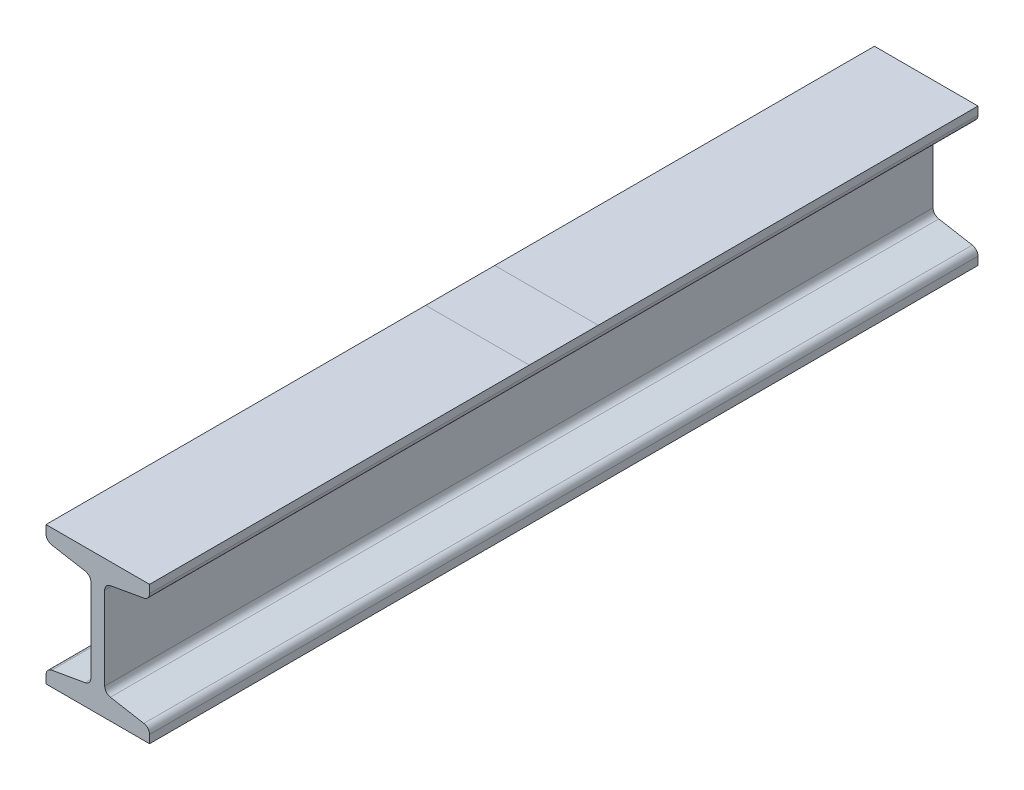
ISO-10303-21;
HEADER;
FILE_DESCRIPTION(('STEP AP214'),'2;1');
FILE_NAME('part.step','',(''),(''),'','','');
FILE_SCHEMA(('AUTOMOTIVE_DESIGN { 1 0 10303 214 1 1 1 1 }'));
ENDSEC;
DATA;
#1=APPLICATION_CONTEXT('core data for automotive mechanical design processes');
#2=APPLICATION_PROTOCOL_DEFINITION('international standard','automotive_design',2000,#1);
#3=PRODUCT_CONTEXT('',#1,'mechanical');
#4=PRODUCT('Part','Part','',(#3));
#5=PRODUCT_RELATED_PRODUCT_CATEGORY('part','',(#4));
#6=PRODUCT_DEFINITION_FORMATION('','',#4);
#7=PRODUCT_DEFINITION_CONTEXT('part definition',#1,'design');
#8=PRODUCT_DEFINITION('design','',#6,#7);
#9=PRODUCT_DEFINITION_SHAPE('','',#8);
#10=(LENGTH_UNIT() NAMED_UNIT(*) SI_UNIT(.MILLI.,.METRE.));
#11=(NAMED_UNIT(*) PLANE_ANGLE_UNIT() SI_UNIT($,.RADIAN.));
#12=(NAMED_UNIT(*) SI_UNIT($,.STERADIAN.) SOLID_ANGLE_UNIT());
#13=UNCERTAINTY_MEASURE_WITH_UNIT(LENGTH_MEASURE(1.E-05),#10,'distance_accuracy_value','');
#14=(GEOMETRIC_REPRESENTATION_CONTEXT(3) GLOBAL_UNCERTAINTY_ASSIGNED_CONTEXT((#13)) GLOBAL_UNIT_ASSIGNED_CONTEXT((#10,
#11,#12)) REPRESENTATION_CONTEXT('',''));
#15=CARTESIAN_POINT('',(0.,0.,0.));
#16=DIRECTION('',(0.,0.,1.));
#17=DIRECTION('',(1.,0.,0.));
#18=AXIS2_PLACEMENT_3D('',#15,#16,#17);
#19=CARTESIAN_POINT('',(-37.5,-50.,600.));
#20=DIRECTION('',(0.,1.,0.));
#21=DIRECTION('',(0.,0.,1.));
#22=AXIS2_PLACEMENT_3D('',#19,#20,#21);
#23=PLANE('',#22);
#24=DIRECTION('',(-1.,0.,0.));
#25=VECTOR('',#24,1.);
#26=CARTESIAN_POINT('',(-37.5000000000003,-50.,40.));
#27=LINE('',#26,#25);
#28=CARTESIAN_POINT('',(37.5,-50.,40.));
#29=VERTEX_POINT('',#28);
#30=CARTESIAN_POINT('',(-37.5,-50.,40.));
#31=VERTEX_POINT('',#30);
#32=EDGE_CURVE('E280',#29,#31,#27,.T.);
#33=ORIENTED_EDGE('',*,*,#32,.F.);
#34=DIRECTION('',(0.,0.,-1.));
#35=VECTOR('',#34,1.);
#36=CARTESIAN_POINT('',(37.5,-50.,600.));
#37=LINE('',#36,#35);
#38=CARTESIAN_POINT('',(37.5,-50.,560.));
#39=VERTEX_POINT('',#38);
#40=EDGE_CURVE('E519',#39,#29,#37,.T.);
#41=ORIENTED_EDGE('',*,*,#40,.F.);
#42=DIRECTION('',(1.,0.,0.));
#43=VECTOR('',#42,1.);
#44=CARTESIAN_POINT('',(-37.5,-50.,560.));
#45=LINE('',#44,#43);
#46=CARTESIAN_POINT('',(-37.5,-50.,560.));
#47=VERTEX_POINT('',#46);
#48=EDGE_CURVE('E286',#47,#39,#45,.T.);
#49=ORIENTED_EDGE('',*,*,#48,.F.);
#50=DIRECTION('',(0.,0.,-1.));
#51=VECTOR('',#50,1.);
#52=CARTESIAN_POINT('',(-37.5,-50.,600.));
#53=LINE('',#52,#51);
#54=EDGE_CURVE('E359',#47,#31,#53,.T.);
#55=ORIENTED_EDGE('',*,*,#54,.T.);
#56=EDGE_LOOP('',(#33,#41,#49,#55));
#57=FACE_BOUND('',#56,.T.);
#58=ADVANCED_FACE('F54',(#57),#23,.F.);
#59=CARTESIAN_POINT('',(37.5,-50.,0.));
#60=VERTEX_POINT('',#59);
#61=EDGE_CURVE('E523',#29,#60,#37,.T.);
#62=ORIENTED_EDGE('',*,*,#61,.F.);
#63=ORIENTED_EDGE('',*,*,#32,.T.);
#64=CARTESIAN_POINT('',(-37.5,-50.,0.));
#65=VERTEX_POINT('',#64);
#66=EDGE_CURVE('E360',#31,#65,#53,.T.);
#67=ORIENTED_EDGE('',*,*,#66,.T.);
#68=DIRECTION('',(1.,0.,0.));
#69=VECTOR('',#68,1.);
#70=CARTESIAN_POINT('',(-37.5,-50.,0.));
#71=LINE('',#70,#69);
#72=EDGE_CURVE('E384',#65,#60,#71,.T.);
#73=ORIENTED_EDGE('',*,*,#72,.T.);
#74=EDGE_LOOP('',(#62,#63,#67,#73));
#75=FACE_BOUND('',#74,.T.);
#76=ADVANCED_FACE('F572',(#75),#23,.F.);
#77=CARTESIAN_POINT('',(-37.5,50.,600.));
#78=DIRECTION('',(0.,-1.,0.));
#79=DIRECTION('',(0.,0.,-1.));
#80=AXIS2_PLACEMENT_3D('',#77,#78,#79);
#81=PLANE('',#80);
#82=DIRECTION('',(-1.,0.,0.));
#83=VECTOR('',#82,1.);
#84=CARTESIAN_POINT('',(-37.5,50.,275.));
#85=LINE('',#84,#83);
#86=CARTESIAN_POINT('',(37.5,50.,275.));
#87=VERTEX_POINT('',#86);
#88=CARTESIAN_POINT('',(-37.5,50.,275.));
#89=VERTEX_POINT('',#88);
#90=EDGE_CURVE('E495',#87,#89,#85,.T.);
#91=ORIENTED_EDGE('',*,*,#90,.F.);
#92=DIRECTION('',(0.,0.,-1.));
#93=VECTOR('',#92,1.);
#94=CARTESIAN_POINT('',(37.5,50.,600.));
#95=LINE('',#94,#93);
#96=CARTESIAN_POINT('',(37.5,50.,0.));
#97=VERTEX_POINT('',#96);
#98=EDGE_CURVE('E243',#87,#97,#95,.T.);
#99=ORIENTED_EDGE('',*,*,#98,.T.);
#100=DIRECTION('',(-1.,0.,0.));
#101=VECTOR('',#100,1.);
#102=CARTESIAN_POINT('',(-37.5,50.,0.));
#103=LINE('',#102,#101);
#104=CARTESIAN_POINT('',(-37.5,50.,0.));
#105=VERTEX_POINT('',#104);
#106=EDGE_CURVE('E420',#97,#105,#103,.T.);
#107=ORIENTED_EDGE('',*,*,#106,.T.);
#108=DIRECTION('',(0.,0.,-1.));
#109=VECTOR('',#108,1.);
#110=CARTESIAN_POINT('',(-37.5,50.,600.));
#111=LINE('',#110,#109);
#112=EDGE_CURVE('E358',#89,#105,#111,.T.);
#113=ORIENTED_EDGE('',*,*,#112,.F.);
#114=EDGE_LOOP('',(#91,#99,#107,#113));
#115=FACE_BOUND('',#114,.T.);
#116=ADVANCED_FACE('F494',(#115),#81,.F.);
#117=DIRECTION('',(1.,0.,0.));
#118=VECTOR('',#117,1.);
#119=CARTESIAN_POINT('',(-37.5,50.,325.));
#120=LINE('',#119,#118);
#121=CARTESIAN_POINT('',(-37.5,50.,325.));
#122=VERTEX_POINT('',#121);
#123=CARTESIAN_POINT('',(37.5,50.,325.));
#124=VERTEX_POINT('',#123);
#125=EDGE_CURVE('E241',#122,#124,#120,.T.);
#126=ORIENTED_EDGE('',*,*,#125,.F.);
#127=CARTESIAN_POINT('',(-37.5,50.,600.));
#128=VERTEX_POINT('',#127);
#129=EDGE_CURVE('E246',#128,#122,#111,.T.);
#130=ORIENTED_EDGE('',*,*,#129,.F.);
#131=DIRECTION('',(-1.,0.,0.));
#132=VECTOR('',#131,1.);
#133=CARTESIAN_POINT('',(-37.5,50.,600.));
#134=LINE('',#133,#132);
#135=CARTESIAN_POINT('',(37.5,50.,600.));
#136=VERTEX_POINT('',#135);
#137=EDGE_CURVE('E221',#136,#128,#134,.T.);
#138=ORIENTED_EDGE('',*,*,#137,.F.);
#139=EDGE_CURVE('E234',#136,#124,#95,.T.);
#140=ORIENTED_EDGE('',*,*,#139,.T.);
#141=EDGE_LOOP('',(#126,#130,#138,#140));
#142=FACE_BOUND('',#141,.T.);
#143=ADVANCED_FACE('F244',(#142),#81,.F.);
#144=CARTESIAN_POINT('',(37.5,40.,600.));
#145=DIRECTION('',(-0.173648177666934,0.984807753012207,0.));
#146=DIRECTION('',(-0.984807753012208,-0.173648177666934,0.));
#147=AXIS2_PLACEMENT_3D('',#144,#145,#146);
#148=PLANE('',#147);
#149=DIRECTION('',(0.984807753012207,0.173648177666934,0.));
#150=VECTOR('',#149,1.);
#151=CARTESIAN_POINT('',(37.5,40.,0.));
#152=LINE('',#151,#150);
#153=CARTESIAN_POINT('',(9.13175911166535,34.9979137361494,0.));
#154=VERTEX_POINT('',#153);
#155=CARTESIAN_POINT('',(33.3682408883347,39.2714593908254,0.));
#156=VERTEX_POINT('',#155);
#157=EDGE_CURVE('E422',#154,#156,#152,.T.);
#158=ORIENTED_EDGE('',*,*,#157,.T.);
#159=DIRECTION('',(0.,0.,-1.));
#160=VECTOR('',#159,1.);
#161=CARTESIAN_POINT('',(33.3682408883347,39.2714593908254,600.));
#162=LINE('',#161,#160);
#163=CARTESIAN_POINT('',(33.3682408883347,39.2714593908254,600.));
#164=VERTEX_POINT('',#163);
#165=EDGE_CURVE('E327',#156,#164,#162,.F.);
#166=ORIENTED_EDGE('',*,*,#165,.T.);
#167=DIRECTION('',(0.984807753012207,0.173648177666934,0.));
#168=VECTOR('',#167,1.);
#169=CARTESIAN_POINT('',(37.5,40.,600.));
#170=LINE('',#169,#168);
#171=CARTESIAN_POINT('',(9.13175911166535,34.9979137361494,600.));
#172=VERTEX_POINT('',#171);
#173=EDGE_CURVE('E230',#172,#164,#170,.T.);
#174=ORIENTED_EDGE('',*,*,#173,.F.);
#175=DIRECTION('',(0.,0.,-1.));
#176=VECTOR('',#175,1.);
#177=CARTESIAN_POINT('',(9.13175911166535,34.9979137361494,0.));
#178=LINE('',#177,#176);
#179=EDGE_CURVE('E323',#172,#154,#178,.T.);
#180=ORIENTED_EDGE('',*,*,#179,.T.);
#181=EDGE_LOOP('',(#158,#166,#174,#180));
#182=FACE_BOUND('',#181,.T.);
#183=ADVANCED_FACE('F599',(#182),#148,.F.);
#184=CARTESIAN_POINT('',(37.5,50.,600.));
#185=DIRECTION('',(-1.,0.,0.));
#186=DIRECTION('',(0.,-1.,0.));
#187=AXIS2_PLACEMENT_3D('',#184,#185,#186);
#188=PLANE('',#187);
#189=DIRECTION('',(0.,1.,0.));
#190=VECTOR('',#189,1.);
#191=CARTESIAN_POINT('',(37.5,50.,600.));
#192=LINE('',#191,#190);
#193=CARTESIAN_POINT('',(37.5,44.1954981558864,600.));
#194=VERTEX_POINT('',#193);
#195=EDGE_CURVE('E215',#194,#136,#192,.T.);
#196=ORIENTED_EDGE('',*,*,#195,.F.);
#197=DIRECTION('',(0.,0.,-1.));
#198=VECTOR('',#197,1.);
#199=CARTESIAN_POINT('',(37.5,44.1954981558864,600.));
#200=LINE('',#199,#198);
#201=CARTESIAN_POINT('',(37.5,44.1954981558864,0.));
#202=VERTEX_POINT('',#201);
#203=EDGE_CURVE('E320',#194,#202,#200,.T.);
#204=ORIENTED_EDGE('',*,*,#203,.T.);
#205=DIRECTION('',(0.,1.,0.));
#206=VECTOR('',#205,1.);
#207=CARTESIAN_POINT('',(37.5,50.,0.));
#208=LINE('',#207,#206);
#209=EDGE_CURVE('E410',#202,#97,#208,.T.);
#210=ORIENTED_EDGE('',*,*,#209,.T.);
#211=ORIENTED_EDGE('',*,*,#98,.F.);
#212=EDGE_CURVE('E238',#124,#87,#95,.T.);
#213=ORIENTED_EDGE('',*,*,#212,.F.);
#214=ORIENTED_EDGE('',*,*,#139,.F.);
#215=EDGE_LOOP('',(#196,#204,#210,#211,#213,#214));
#216=FACE_BOUND('',#215,.T.);
#217=ADVANCED_FACE('F235',(#216),#188,.F.);
#218=ORIENTED_EDGE('',*,*,#212,.T.);
#219=ORIENTED_EDGE('',*,*,#90,.T.);
#220=EDGE_CURVE('E366',#122,#89,#111,.T.);
#221=ORIENTED_EDGE('',*,*,#220,.F.);
#222=ORIENTED_EDGE('',*,*,#125,.T.);
#223=EDGE_LOOP('',(#218,#219,#221,#222));
#224=FACE_BOUND('',#223,.T.);
#225=ADVANCED_FACE('F499',(#224),#81,.F.);
#226=CARTESIAN_POINT('',(-37.5,50.,600.));
#227=DIRECTION('',(1.,0.,0.));
#228=DIRECTION('',(0.,0.,-1.));
#229=AXIS2_PLACEMENT_3D('',#226,#227,#228);
#230=PLANE('',#229);
#231=DIRECTION('',(0.,-1.,0.));
#232=VECTOR('',#231,1.);
#233=CARTESIAN_POINT('',(-37.5,50.,0.));
#234=LINE('',#233,#232);
#235=CARTESIAN_POINT('',(-37.5,44.1954981558864,0.));
#236=VERTEX_POINT('',#235);
#237=EDGE_CURVE('E426',#105,#236,#234,.T.);
#238=ORIENTED_EDGE('',*,*,#237,.T.);
#239=DIRECTION('',(0.,0.,-1.));
#240=VECTOR('',#239,1.);
#241=CARTESIAN_POINT('',(-37.5,44.1954981558864,600.));
#242=LINE('',#241,#240);
#243=CARTESIAN_POINT('',(-37.5,44.1954981558864,600.));
#244=VERTEX_POINT('',#243);
#245=EDGE_CURVE('E337',#236,#244,#242,.F.);
#246=ORIENTED_EDGE('',*,*,#245,.T.);
#247=DIRECTION('',(0.,-1.,0.));
#248=VECTOR('',#247,1.);
#249=CARTESIAN_POINT('',(-37.5,50.,600.));
#250=LINE('',#249,#248);
#251=EDGE_CURVE('E249',#128,#244,#250,.T.);
#252=ORIENTED_EDGE('',*,*,#251,.F.);
#253=ORIENTED_EDGE('',*,*,#129,.T.);
#254=ORIENTED_EDGE('',*,*,#220,.T.);
#255=ORIENTED_EDGE('',*,*,#112,.T.);
#256=EDGE_LOOP('',(#238,#246,#252,#253,#254,#255));
#257=FACE_BOUND('',#256,.T.);
#258=ADVANCED_FACE('F488',(#257),#230,.F.);
#259=CARTESIAN_POINT('',(-37.5,40.,600.));
#260=DIRECTION('',(0.173648177666934,0.984807753012207,0.));
#261=DIRECTION('',(-0.984807753012208,0.173648177666934,0.));
#262=AXIS2_PLACEMENT_3D('',#259,#260,#261);
#263=PLANE('',#262);
#264=DIRECTION('',(0.984807753012207,-0.173648177666934,0.));
#265=VECTOR('',#264,1.);
#266=CARTESIAN_POINT('',(-37.5,40.,600.));
#267=LINE('',#266,#265);
#268=CARTESIAN_POINT('',(-33.3682408883347,39.2714593908254,600.));
#269=VERTEX_POINT('',#268);
#270=CARTESIAN_POINT('',(-9.13175911166534,34.9979137361494,600.));
#271=VERTEX_POINT('',#270);
#272=EDGE_CURVE('E252',#269,#271,#267,.T.);
#273=ORIENTED_EDGE('',*,*,#272,.F.);
#274=DIRECTION('',(0.,0.,-1.));
#275=VECTOR('',#274,1.);
#276=CARTESIAN_POINT('',(-33.3682408883347,39.2714593908254,600.));
#277=LINE('',#276,#275);
#278=CARTESIAN_POINT('',(-33.3682408883347,39.2714593908254,0.));
#279=VERTEX_POINT('',#278);
#280=EDGE_CURVE('E333',#269,#279,#277,.T.);
#281=ORIENTED_EDGE('',*,*,#280,.T.);
#282=DIRECTION('',(0.984807753012207,-0.173648177666934,0.));
#283=VECTOR('',#282,1.);
#284=CARTESIAN_POINT('',(-37.5,40.,0.));
#285=LINE('',#284,#283);
#286=CARTESIAN_POINT('',(-9.13175911166534,34.9979137361494,0.));
#287=VERTEX_POINT('',#286);
#288=EDGE_CURVE('E433',#279,#287,#285,.T.);
#289=ORIENTED_EDGE('',*,*,#288,.T.);
#290=DIRECTION('',(0.,0.,-1.));
#291=VECTOR('',#290,1.);
#292=CARTESIAN_POINT('',(-9.13175911166534,34.9979137361494,600.));
#293=LINE('',#292,#291);
#294=EDGE_CURVE('E330',#287,#271,#293,.F.);
#295=ORIENTED_EDGE('',*,*,#294,.T.);
#296=EDGE_LOOP('',(#273,#281,#289,#295));
#297=FACE_BOUND('',#296,.T.);
#298=ADVANCED_FACE('F481',(#297),#263,.F.);
#299=CARTESIAN_POINT('',(-4.99999999999998,-34.2693731269748,600.));
#300=DIRECTION('',(1.,0.,0.));
#301=DIRECTION('',(0.,1.,0.));
#302=AXIS2_PLACEMENT_3D('',#299,#300,#301);
#303=PLANE('',#302);
#304=DIRECTION('',(0.,-1.,0.));
#305=VECTOR('',#304,1.);
#306=CARTESIAN_POINT('',(-4.99999999999998,-34.2693731269748,0.));
#307=LINE('',#306,#305);
#308=CARTESIAN_POINT('',(-5.,30.0738749710884,0.));
#309=VERTEX_POINT('',#308);
#310=CARTESIAN_POINT('',(-4.99999999999998,-30.0738749710884,0.));
#311=VERTEX_POINT('',#310);
#312=EDGE_CURVE('E380',#309,#311,#307,.T.);
#313=ORIENTED_EDGE('',*,*,#312,.T.);
#314=DIRECTION('',(0.,0.,-1.));
#315=VECTOR('',#314,1.);
#316=CARTESIAN_POINT('',(-4.99999999999998,-30.0738749710884,600.));
#317=LINE('',#316,#315);
#318=CARTESIAN_POINT('',(-4.99999999999998,-30.0738749710884,600.));
#319=VERTEX_POINT('',#318);
#320=EDGE_CURVE('E447',#311,#319,#317,.F.);
#321=ORIENTED_EDGE('',*,*,#320,.T.);
#322=DIRECTION('',(0.,-1.,0.));
#323=VECTOR('',#322,1.);
#324=CARTESIAN_POINT('',(-4.99999999999998,-34.2693731269748,600.));
#325=LINE('',#324,#323);
#326=CARTESIAN_POINT('',(-5.,30.0738749710884,600.));
#327=VERTEX_POINT('',#326);
#328=EDGE_CURVE('E259',#327,#319,#325,.T.);
#329=ORIENTED_EDGE('',*,*,#328,.F.);
#330=DIRECTION('',(0.,0.,-1.));
#331=VECTOR('',#330,1.);
#332=CARTESIAN_POINT('',(-5.,30.0738749710884,0.));
#333=LINE('',#332,#331);
#334=EDGE_CURVE('E449',#327,#309,#333,.T.);
#335=ORIENTED_EDGE('',*,*,#334,.T.);
#336=EDGE_LOOP('',(#313,#321,#329,#335));
#337=FACE_BOUND('',#336,.T.);
#338=ADVANCED_FACE('F445',(#337),#303,.F.);
#339=CARTESIAN_POINT('',(-37.5,-40.,600.));
#340=DIRECTION('',(0.173648177666934,-0.984807753012207,0.));
#341=DIRECTION('',(0.984807753012208,0.173648177666934,0.));
#342=AXIS2_PLACEMENT_3D('',#339,#340,#341);
#343=PLANE('',#342);
#344=DIRECTION('',(-0.984807753012207,-0.173648177666934,0.));
#345=VECTOR('',#344,1.);
#346=CARTESIAN_POINT('',(-37.5,-40.,0.));
#347=LINE('',#346,#345);
#348=CARTESIAN_POINT('',(-9.13175911166532,-34.9979137361494,0.));
#349=VERTEX_POINT('',#348);
#350=CARTESIAN_POINT('',(-33.3682408883347,-39.2714593908254,0.));
#351=VERTEX_POINT('',#350);
#352=EDGE_CURVE('E373',#349,#351,#347,.T.);
#353=ORIENTED_EDGE('',*,*,#352,.T.);
#354=DIRECTION('',(0.,0.,-1.));
#355=VECTOR('',#354,1.);
#356=CARTESIAN_POINT('',(-33.3682408883347,-39.2714593908254,600.));
#357=LINE('',#356,#355);
#358=CARTESIAN_POINT('',(-33.3682408883347,-39.2714593908254,600.));
#359=VERTEX_POINT('',#358);
#360=EDGE_CURVE('E550',#351,#359,#357,.F.);
#361=ORIENTED_EDGE('',*,*,#360,.T.);
#362=DIRECTION('',(-0.984807753012207,-0.173648177666934,0.));
#363=VECTOR('',#362,1.);
#364=CARTESIAN_POINT('',(-37.5,-40.,600.));
#365=LINE('',#364,#363);
#366=CARTESIAN_POINT('',(-9.13175911166532,-34.9979137361494,600.));
#367=VERTEX_POINT('',#366);
#368=EDGE_CURVE('E263',#367,#359,#365,.T.);
#369=ORIENTED_EDGE('',*,*,#368,.F.);
#370=DIRECTION('',(0.,0.,-1.));
#371=VECTOR('',#370,1.);
#372=CARTESIAN_POINT('',(-9.13175911166532,-34.9979137361494,0.));
#373=LINE('',#372,#371);
#374=EDGE_CURVE('E345',#367,#349,#373,.T.);
#375=ORIENTED_EDGE('',*,*,#374,.T.);
#376=EDGE_LOOP('',(#353,#361,#369,#375));
#377=FACE_BOUND('',#376,.T.);
#378=ADVANCED_FACE('F558',(#377),#343,.F.);
#379=CARTESIAN_POINT('',(-37.5,-50.,600.));
#380=DIRECTION('',(1.,0.,0.));
#381=DIRECTION('',(0.,1.,0.));
#382=AXIS2_PLACEMENT_3D('',#379,#380,#381);
#383=PLANE('',#382);
#384=DIRECTION('',(0.,-1.,0.));
#385=VECTOR('',#384,1.);
#386=CARTESIAN_POINT('',(-37.5,-50.,600.));
#387=LINE('',#386,#385);
#388=CARTESIAN_POINT('',(-37.5,-44.1954981558864,600.));
#389=VERTEX_POINT('',#388);
#390=CARTESIAN_POINT('',(-37.5,-50.,600.));
#391=VERTEX_POINT('',#390);
#392=EDGE_CURVE('E267',#389,#391,#387,.T.);
#393=ORIENTED_EDGE('',*,*,#392,.F.);
#394=DIRECTION('',(0.,0.,-1.));
#395=VECTOR('',#394,1.);
#396=CARTESIAN_POINT('',(-37.5,-44.1954981558864,600.));
#397=LINE('',#396,#395);
#398=CARTESIAN_POINT('',(-37.5,-44.1954981558864,0.));
#399=VERTEX_POINT('',#398);
#400=EDGE_CURVE('E340',#389,#399,#397,.T.);
#401=ORIENTED_EDGE('',*,*,#400,.T.);
#402=DIRECTION('',(0.,-1.,0.));
#403=VECTOR('',#402,1.);
#404=CARTESIAN_POINT('',(-37.5,-50.,0.));
#405=LINE('',#404,#403);
#406=EDGE_CURVE('E379',#399,#65,#405,.T.);
#407=ORIENTED_EDGE('',*,*,#406,.T.);
#408=ORIENTED_EDGE('',*,*,#66,.F.);
#409=ORIENTED_EDGE('',*,*,#54,.F.);
#410=EDGE_CURVE('E353',#391,#47,#53,.T.);
#411=ORIENTED_EDGE('',*,*,#410,.F.);
#412=EDGE_LOOP('',(#393,#401,#407,#408,#409,#411));
#413=FACE_BOUND('',#412,.T.);
#414=ADVANCED_FACE('F567',(#413),#383,.F.);
#415=ORIENTED_EDGE('',*,*,#410,.T.);
#416=ORIENTED_EDGE('',*,*,#48,.T.);
#417=CARTESIAN_POINT('',(37.5,-50.,600.));
#418=VERTEX_POINT('',#417);
#419=EDGE_CURVE('E361',#418,#39,#37,.T.);
#420=ORIENTED_EDGE('',*,*,#419,.F.);
#421=DIRECTION('',(1.,0.,0.));
#422=VECTOR('',#421,1.);
#423=CARTESIAN_POINT('',(-37.5,-50.,600.));
#424=LINE('',#423,#422);
#425=EDGE_CURVE('E270',#391,#418,#424,.T.);
#426=ORIENTED_EDGE('',*,*,#425,.F.);
#427=EDGE_LOOP('',(#415,#416,#420,#426));
#428=FACE_BOUND('',#427,.T.);
#429=ADVANCED_FACE('F510',(#428),#23,.F.);
#430=CARTESIAN_POINT('',(37.5,-50.,600.));
#431=DIRECTION('',(-1.,0.,0.));
#432=DIRECTION('',(0.,-1.,0.));
#433=AXIS2_PLACEMENT_3D('',#430,#431,#432);
#434=PLANE('',#433);
#435=DIRECTION('',(0.,1.,0.));
#436=VECTOR('',#435,1.);
#437=CARTESIAN_POINT('',(37.5,-50.,0.));
#438=LINE('',#437,#436);
#439=CARTESIAN_POINT('',(37.5,-44.1954981558864,0.));
#440=VERTEX_POINT('',#439);
#441=EDGE_CURVE('E389',#60,#440,#438,.T.);
#442=ORIENTED_EDGE('',*,*,#441,.T.);
#443=DIRECTION('',(0.,0.,-1.));
#444=VECTOR('',#443,1.);
#445=CARTESIAN_POINT('',(37.5,-44.1954981558864,600.));
#446=LINE('',#445,#444);
#447=CARTESIAN_POINT('',(37.5,-44.1954981558864,600.));
#448=VERTEX_POINT('',#447);
#449=EDGE_CURVE('E306',#440,#448,#446,.F.);
#450=ORIENTED_EDGE('',*,*,#449,.T.);
#451=DIRECTION('',(0.,1.,0.));
#452=VECTOR('',#451,1.);
#453=CARTESIAN_POINT('',(37.5,-50.,600.));
#454=LINE('',#453,#452);
#455=EDGE_CURVE('E274',#418,#448,#454,.T.);
#456=ORIENTED_EDGE('',*,*,#455,.F.);
#457=ORIENTED_EDGE('',*,*,#419,.T.);
#458=ORIENTED_EDGE('',*,*,#40,.T.);
#459=ORIENTED_EDGE('',*,*,#61,.T.);
#460=EDGE_LOOP('',(#442,#450,#456,#457,#458,#459));
#461=FACE_BOUND('',#460,.T.);
#462=ADVANCED_FACE('F524',(#461),#434,.F.);
#463=CARTESIAN_POINT('',(37.5,-40.,600.));
#464=DIRECTION('',(-0.173648177666934,-0.984807753012207,0.));
#465=DIRECTION('',(0.984807753012208,-0.173648177666934,0.));
#466=AXIS2_PLACEMENT_3D('',#463,#464,#465);
#467=PLANE('',#466);
#468=DIRECTION('',(-0.984807753012207,0.173648177666934,0.));
#469=VECTOR('',#468,1.);
#470=CARTESIAN_POINT('',(37.5,-40.,600.));
#471=LINE('',#470,#469);
#472=CARTESIAN_POINT('',(33.3682408883347,-39.2714593908254,600.));
#473=VERTEX_POINT('',#472);
#474=CARTESIAN_POINT('',(9.13175911166534,-34.9979137361494,600.));
#475=VERTEX_POINT('',#474);
#476=EDGE_CURVE('E531',#473,#475,#471,.T.);
#477=ORIENTED_EDGE('',*,*,#476,.F.);
#478=DIRECTION('',(0.,0.,-1.));
#479=VECTOR('',#478,1.);
#480=CARTESIAN_POINT('',(33.3682408883347,-39.2714593908254,600.));
#481=LINE('',#480,#479);
#482=CARTESIAN_POINT('',(33.3682408883347,-39.2714593908254,0.));
#483=VERTEX_POINT('',#482);
#484=EDGE_CURVE('E290',#473,#483,#481,.T.);
#485=ORIENTED_EDGE('',*,*,#484,.T.);
#486=DIRECTION('',(-0.984807753012207,0.173648177666934,0.));
#487=VECTOR('',#486,1.);
#488=CARTESIAN_POINT('',(37.5,-40.,0.));
#489=LINE('',#488,#487);
#490=CARTESIAN_POINT('',(9.13175911166534,-34.9979137361494,0.));
#491=VERTEX_POINT('',#490);
#492=EDGE_CURVE('E393',#483,#491,#489,.T.);
#493=ORIENTED_EDGE('',*,*,#492,.T.);
#494=DIRECTION('',(0.,0.,-1.));
#495=VECTOR('',#494,1.);
#496=CARTESIAN_POINT('',(9.13175911166534,-34.9979137361494,600.));
#497=LINE('',#496,#495);
#498=EDGE_CURVE('E285',#491,#475,#497,.F.);
#499=ORIENTED_EDGE('',*,*,#498,.T.);
#500=EDGE_LOOP('',(#477,#485,#493,#499));
#501=FACE_BOUND('',#500,.T.);
#502=ADVANCED_FACE('F541',(#501),#467,.F.);
#503=CARTESIAN_POINT('',(5.00000000000001,-34.2693731269748,600.));
#504=DIRECTION('',(-1.,0.,0.));
#505=DIRECTION('',(0.,-1.,0.));
#506=AXIS2_PLACEMENT_3D('',#503,#504,#505);
#507=PLANE('',#506);
#508=DIRECTION('',(0.,1.,0.));
#509=VECTOR('',#508,1.);
#510=CARTESIAN_POINT('',(5.00000000000001,-34.2693731269748,600.));
#511=LINE('',#510,#509);
#512=CARTESIAN_POINT('',(5.00000000000001,-30.0738749710884,600.));
#513=VERTEX_POINT('',#512);
#514=CARTESIAN_POINT('',(5.00000000000002,30.0738749710884,600.));
#515=VERTEX_POINT('',#514);
#516=EDGE_CURVE('E529',#513,#515,#511,.T.);
#517=ORIENTED_EDGE('',*,*,#516,.F.);
#518=DIRECTION('',(0.,0.,-1.));
#519=VECTOR('',#518,1.);
#520=CARTESIAN_POINT('',(5.00000000000001,-30.0738749710884,0.));
#521=LINE('',#520,#519);
#522=CARTESIAN_POINT('',(5.00000000000001,-30.0738749710884,0.));
#523=VERTEX_POINT('',#522);
#524=EDGE_CURVE('E463',#513,#523,#521,.T.);
#525=ORIENTED_EDGE('',*,*,#524,.T.);
#526=DIRECTION('',(0.,1.,0.));
#527=VECTOR('',#526,1.);
#528=CARTESIAN_POINT('',(5.00000000000001,-34.2693731269748,0.));
#529=LINE('',#528,#527);
#530=CARTESIAN_POINT('',(5.00000000000002,30.0738749710884,0.));
#531=VERTEX_POINT('',#530);
#532=EDGE_CURVE('E396',#523,#531,#529,.T.);
#533=ORIENTED_EDGE('',*,*,#532,.T.);
#534=DIRECTION('',(0.,0.,-1.));
#535=VECTOR('',#534,1.);
#536=CARTESIAN_POINT('',(5.00000000000002,30.0738749710884,600.));
#537=LINE('',#536,#535);
#538=EDGE_CURVE('E70',#531,#515,#537,.F.);
#539=ORIENTED_EDGE('',*,*,#538,.T.);
#540=EDGE_LOOP('',(#517,#525,#533,#539));
#541=FACE_BOUND('',#540,.T.);
#542=ADVANCED_FACE('F547',(#541),#507,.F.);
#543=CARTESIAN_POINT('',(0.,0.,600.));
#544=DIRECTION('',(0.,0.,-1.));
#545=DIRECTION('',(-1.,0.,0.));
#546=AXIS2_PLACEMENT_3D('',#543,#544,#545);
#547=PLANE('',#546);
#548=ORIENTED_EDGE('',*,*,#455,.T.);
#549=CARTESIAN_POINT('',(32.5,-44.1954981558864,600.));
#550=DIRECTION('',(0.,0.,-1.));
#551=DIRECTION('',(-1.,0.,0.));
#552=AXIS2_PLACEMENT_3D('',#549,#550,#551);
#553=CIRCLE('',#552,5.);
#554=EDGE_CURVE('E317',#448,#473,#553,.F.);
#555=ORIENTED_EDGE('',*,*,#554,.T.);
#556=ORIENTED_EDGE('',*,*,#476,.T.);
#557=CARTESIAN_POINT('',(10.,-30.0738749710884,600.));
#558=DIRECTION('',(0.,0.,-1.));
#559=DIRECTION('',(-1.,0.,0.));
#560=AXIS2_PLACEMENT_3D('',#557,#558,#559);
#561=CIRCLE('',#560,5.);
#562=EDGE_CURVE('E77',#475,#513,#561,.T.);
#563=ORIENTED_EDGE('',*,*,#562,.T.);
#564=ORIENTED_EDGE('',*,*,#516,.T.);
#565=CARTESIAN_POINT('',(10.,30.0738749710884,600.));
#566=DIRECTION('',(0.,0.,-1.));
#567=DIRECTION('',(-1.,0.,0.));
#568=AXIS2_PLACEMENT_3D('',#565,#566,#567);
#569=CIRCLE('',#568,5.);
#570=EDGE_CURVE('E403',#515,#172,#569,.T.);
#571=ORIENTED_EDGE('',*,*,#570,.T.);
#572=ORIENTED_EDGE('',*,*,#173,.T.);
#573=CARTESIAN_POINT('',(32.5,44.1954981558864,600.));
#574=DIRECTION('',(0.,0.,-1.));
#575=DIRECTION('',(-1.,0.,0.));
#576=AXIS2_PLACEMENT_3D('',#573,#574,#575);
#577=CIRCLE('',#576,5.);
#578=EDGE_CURVE('E225',#164,#194,#577,.F.);
#579=ORIENTED_EDGE('',*,*,#578,.T.);
#580=ORIENTED_EDGE('',*,*,#195,.T.);
#581=ORIENTED_EDGE('',*,*,#137,.T.);
#582=ORIENTED_EDGE('',*,*,#251,.T.);
#583=CARTESIAN_POINT('',(-32.5,44.1954981558864,600.));
#584=DIRECTION('',(0.,0.,-1.));
#585=DIRECTION('',(-1.,0.,0.));
#586=AXIS2_PLACEMENT_3D('',#583,#584,#585);
#587=CIRCLE('',#586,5.);
#588=EDGE_CURVE('E312',#244,#269,#587,.F.);
#589=ORIENTED_EDGE('',*,*,#588,.T.);
#590=ORIENTED_EDGE('',*,*,#272,.T.);
#591=CARTESIAN_POINT('',(-10.,30.0738749710884,600.));
#592=DIRECTION('',(0.,0.,-1.));
#593=DIRECTION('',(-1.,0.,0.));
#594=AXIS2_PLACEMENT_3D('',#591,#592,#593);
#595=CIRCLE('',#594,5.);
#596=EDGE_CURVE('E12',#271,#327,#595,.T.);
#597=ORIENTED_EDGE('',*,*,#596,.T.);
#598=ORIENTED_EDGE('',*,*,#328,.T.);
#599=CARTESIAN_POINT('',(-9.99999999999998,-30.0738749710884,600.));
#600=DIRECTION('',(0.,0.,-1.));
#601=DIRECTION('',(-1.,0.,0.));
#602=AXIS2_PLACEMENT_3D('',#599,#600,#601);
#603=CIRCLE('',#602,5.);
#604=EDGE_CURVE('E456',#319,#367,#603,.T.);
#605=ORIENTED_EDGE('',*,*,#604,.T.);
#606=ORIENTED_EDGE('',*,*,#368,.T.);
#607=CARTESIAN_POINT('',(-32.5,-44.1954981558864,600.));
#608=DIRECTION('',(0.,0.,-1.));
#609=DIRECTION('',(-1.,0.,0.));
#610=AXIS2_PLACEMENT_3D('',#607,#608,#609);
#611=CIRCLE('',#610,5.);
#612=EDGE_CURVE('E309',#359,#389,#611,.F.);
#613=ORIENTED_EDGE('',*,*,#612,.T.);
#614=ORIENTED_EDGE('',*,*,#392,.T.);
#615=ORIENTED_EDGE('',*,*,#425,.T.);
#616=EDGE_LOOP('',(#548,#555,#556,#563,#564,#571,#572,#579,#580,#581,#582,#589,#590,#597,#598,
#605,#606,#613,#614,#615));
#617=FACE_BOUND('',#616,.T.);
#618=ADVANCED_FACE('F218',(#617),#547,.F.);
#619=CARTESIAN_POINT('',(0.,0.,0.));
#620=DIRECTION('',(0.,0.,-1.));
#621=DIRECTION('',(-1.,0.,0.));
#622=AXIS2_PLACEMENT_3D('',#619,#620,#621);
#623=PLANE('',#622);
#624=ORIENTED_EDGE('',*,*,#492,.F.);
#625=CARTESIAN_POINT('',(32.5,-44.1954981558864,0.));
#626=DIRECTION('',(0.,0.,-1.));
#627=DIRECTION('',(-1.,0.,0.));
#628=AXIS2_PLACEMENT_3D('',#625,#626,#627);
#629=CIRCLE('',#628,5.);
#630=EDGE_CURVE('E303',#483,#440,#629,.T.);
#631=ORIENTED_EDGE('',*,*,#630,.T.);
#632=ORIENTED_EDGE('',*,*,#441,.F.);
#633=ORIENTED_EDGE('',*,*,#72,.F.);
#634=ORIENTED_EDGE('',*,*,#406,.F.);
#635=CARTESIAN_POINT('',(-32.5,-44.1954981558864,0.));
#636=DIRECTION('',(0.,0.,-1.));
#637=DIRECTION('',(-1.,0.,0.));
#638=AXIS2_PLACEMENT_3D('',#635,#636,#637);
#639=CIRCLE('',#638,5.);
#640=EDGE_CURVE('E294',#399,#351,#639,.T.);
#641=ORIENTED_EDGE('',*,*,#640,.T.);
#642=ORIENTED_EDGE('',*,*,#352,.F.);
#643=CARTESIAN_POINT('',(-9.99999999999998,-30.0738749710884,0.));
#644=DIRECTION('',(0.,0.,-1.));
#645=DIRECTION('',(-1.,0.,0.));
#646=AXIS2_PLACEMENT_3D('',#643,#644,#645);
#647=CIRCLE('',#646,5.);
#648=EDGE_CURVE('E454',#349,#311,#647,.F.);
#649=ORIENTED_EDGE('',*,*,#648,.T.);
#650=ORIENTED_EDGE('',*,*,#312,.F.);
#651=CARTESIAN_POINT('',(-10.,30.0738749710884,0.));
#652=DIRECTION('',(0.,0.,-1.));
#653=DIRECTION('',(-1.,0.,0.));
#654=AXIS2_PLACEMENT_3D('',#651,#652,#653);
#655=CIRCLE('',#654,5.);
#656=EDGE_CURVE('E63',#309,#287,#655,.F.);
#657=ORIENTED_EDGE('',*,*,#656,.T.);
#658=ORIENTED_EDGE('',*,*,#288,.F.);
#659=CARTESIAN_POINT('',(-32.5,44.1954981558864,0.));
#660=DIRECTION('',(0.,0.,-1.));
#661=DIRECTION('',(-1.,0.,0.));
#662=AXIS2_PLACEMENT_3D('',#659,#660,#661);
#663=CIRCLE('',#662,5.);
#664=EDGE_CURVE('E297',#279,#236,#663,.T.);
#665=ORIENTED_EDGE('',*,*,#664,.T.);
#666=ORIENTED_EDGE('',*,*,#237,.F.);
#667=ORIENTED_EDGE('',*,*,#106,.F.);
#668=ORIENTED_EDGE('',*,*,#209,.F.);
#669=CARTESIAN_POINT('',(32.5,44.1954981558864,0.));
#670=DIRECTION('',(0.,0.,-1.));
#671=DIRECTION('',(-1.,0.,0.));
#672=AXIS2_PLACEMENT_3D('',#669,#670,#671);
#673=CIRCLE('',#672,5.);
#674=EDGE_CURVE('E300',#202,#156,#673,.T.);
#675=ORIENTED_EDGE('',*,*,#674,.T.);
#676=ORIENTED_EDGE('',*,*,#157,.F.);
#677=CARTESIAN_POINT('',(10.,30.0738749710884,0.));
#678=DIRECTION('',(0.,0.,-1.));
#679=DIRECTION('',(-1.,0.,0.));
#680=AXIS2_PLACEMENT_3D('',#677,#678,#679);
#681=CIRCLE('',#680,5.);
#682=EDGE_CURVE('E473',#154,#531,#681,.F.);
#683=ORIENTED_EDGE('',*,*,#682,.T.);
#684=ORIENTED_EDGE('',*,*,#532,.F.);
#685=CARTESIAN_POINT('',(10.,-30.0738749710884,0.));
#686=DIRECTION('',(0.,0.,-1.));
#687=DIRECTION('',(-1.,0.,0.));
#688=AXIS2_PLACEMENT_3D('',#685,#686,#687);
#689=CIRCLE('',#688,5.);
#690=EDGE_CURVE('E458',#523,#491,#689,.F.);
#691=ORIENTED_EDGE('',*,*,#690,.T.);
#692=EDGE_LOOP('',(#624,#631,#632,#633,#634,#641,#642,#649,#650,#657,#658,#665,#666,#667,#668,
#675,#676,#683,#684,#691));
#693=FACE_BOUND('',#692,.T.);
#694=ADVANCED_FACE('F415',(#693),#623,.T.);
#695=CARTESIAN_POINT('',(32.5,-44.1954981558864,600.));
#696=DIRECTION('',(0.,0.,-1.));
#697=DIRECTION('',(-1.,0.,0.));
#698=AXIS2_PLACEMENT_3D('',#695,#696,#697);
#699=CYLINDRICAL_SURFACE('',#698,5.);
#700=ORIENTED_EDGE('',*,*,#554,.F.);
#701=ORIENTED_EDGE('',*,*,#449,.F.);
#702=ORIENTED_EDGE('',*,*,#630,.F.);
#703=ORIENTED_EDGE('',*,*,#484,.F.);
#704=EDGE_LOOP('',(#700,#701,#702,#703));
#705=FACE_BOUND('',#704,.T.);
#706=ADVANCED_FACE('F539',(#705),#699,.T.);
#707=CARTESIAN_POINT('',(32.5,44.1954981558864,600.));
#708=DIRECTION('',(0.,0.,-1.));
#709=DIRECTION('',(-1.,0.,0.));
#710=AXIS2_PLACEMENT_3D('',#707,#708,#709);
#711=CYLINDRICAL_SURFACE('',#710,5.);
#712=ORIENTED_EDGE('',*,*,#578,.F.);
#713=ORIENTED_EDGE('',*,*,#165,.F.);
#714=ORIENTED_EDGE('',*,*,#674,.F.);
#715=ORIENTED_EDGE('',*,*,#203,.F.);
#716=EDGE_LOOP('',(#712,#713,#714,#715));
#717=FACE_BOUND('',#716,.T.);
#718=ADVANCED_FACE('F408',(#717),#711,.T.);
#719=CARTESIAN_POINT('',(-32.5,44.1954981558864,600.));
#720=DIRECTION('',(0.,0.,-1.));
#721=DIRECTION('',(-1.,0.,0.));
#722=AXIS2_PLACEMENT_3D('',#719,#720,#721);
#723=CYLINDRICAL_SURFACE('',#722,5.);
#724=ORIENTED_EDGE('',*,*,#588,.F.);
#725=ORIENTED_EDGE('',*,*,#245,.F.);
#726=ORIENTED_EDGE('',*,*,#664,.F.);
#727=ORIENTED_EDGE('',*,*,#280,.F.);
#728=EDGE_LOOP('',(#724,#725,#726,#727));
#729=FACE_BOUND('',#728,.T.);
#730=ADVANCED_FACE('F486',(#729),#723,.T.);
#731=CARTESIAN_POINT('',(-32.5,-44.1954981558864,600.));
#732=DIRECTION('',(0.,0.,-1.));
#733=DIRECTION('',(-1.,0.,0.));
#734=AXIS2_PLACEMENT_3D('',#731,#732,#733);
#735=CYLINDRICAL_SURFACE('',#734,5.);
#736=ORIENTED_EDGE('',*,*,#612,.F.);
#737=ORIENTED_EDGE('',*,*,#360,.F.);
#738=ORIENTED_EDGE('',*,*,#640,.F.);
#739=ORIENTED_EDGE('',*,*,#400,.F.);
#740=EDGE_LOOP('',(#736,#737,#738,#739));
#741=FACE_BOUND('',#740,.T.);
#742=ADVANCED_FACE('F564',(#741),#735,.T.);
#743=CARTESIAN_POINT('',(10.,-30.0738749710884,600.));
#744=DIRECTION('',(0.,0.,1.));
#745=DIRECTION('',(1.,0.,0.));
#746=AXIS2_PLACEMENT_3D('',#743,#744,#745);
#747=CYLINDRICAL_SURFACE('',#746,5.);
#748=ORIENTED_EDGE('',*,*,#562,.F.);
#749=ORIENTED_EDGE('',*,*,#498,.F.);
#750=ORIENTED_EDGE('',*,*,#690,.F.);
#751=ORIENTED_EDGE('',*,*,#524,.F.);
#752=EDGE_LOOP('',(#748,#749,#750,#751));
#753=FACE_BOUND('',#752,.T.);
#754=ADVANCED_FACE('F546',(#753),#747,.F.);
#755=CARTESIAN_POINT('',(-9.99999999999998,-30.0738749710884,600.));
#756=DIRECTION('',(0.,0.,1.));
#757=DIRECTION('',(1.,0.,0.));
#758=AXIS2_PLACEMENT_3D('',#755,#756,#757);
#759=CYLINDRICAL_SURFACE('',#758,5.);
#760=ORIENTED_EDGE('',*,*,#604,.F.);
#761=ORIENTED_EDGE('',*,*,#320,.F.);
#762=ORIENTED_EDGE('',*,*,#648,.F.);
#763=ORIENTED_EDGE('',*,*,#374,.F.);
#764=EDGE_LOOP('',(#760,#761,#762,#763));
#765=FACE_BOUND('',#764,.T.);
#766=ADVANCED_FACE('F452',(#765),#759,.F.);
#767=CARTESIAN_POINT('',(10.,30.0738749710884,600.));
#768=DIRECTION('',(0.,0.,1.));
#769=DIRECTION('',(1.,0.,0.));
#770=AXIS2_PLACEMENT_3D('',#767,#768,#769);
#771=CYLINDRICAL_SURFACE('',#770,5.);
#772=ORIENTED_EDGE('',*,*,#570,.F.);
#773=ORIENTED_EDGE('',*,*,#538,.F.);
#774=ORIENTED_EDGE('',*,*,#682,.F.);
#775=ORIENTED_EDGE('',*,*,#179,.F.);
#776=EDGE_LOOP('',(#772,#773,#774,#775));
#777=FACE_BOUND('',#776,.T.);
#778=ADVANCED_FACE('F613',(#777),#771,.F.);
#779=CARTESIAN_POINT('',(-10.,30.0738749710884,600.));
#780=DIRECTION('',(0.,0.,1.));
#781=DIRECTION('',(1.,0.,0.));
#782=AXIS2_PLACEMENT_3D('',#779,#780,#781);
#783=CYLINDRICAL_SURFACE('',#782,5.);
#784=ORIENTED_EDGE('',*,*,#596,.F.);
#785=ORIENTED_EDGE('',*,*,#294,.F.);
#786=ORIENTED_EDGE('',*,*,#656,.F.);
#787=ORIENTED_EDGE('',*,*,#334,.F.);
#788=EDGE_LOOP('',(#784,#785,#786,#787));
#789=FACE_BOUND('',#788,.T.);
#790=ADVANCED_FACE('F56',(#789),#783,.F.);
#791=CLOSED_SHELL('',(#58,#76,#116,#143,#183,#217,#225,#258,#298,#338,#378,#414,#429,#462,#502,
#542,#618,#694,#706,#718,#730,#742,#754,#766,#778,#790));
#792=MANIFOLD_SOLID_BREP('B2',#791);
#793=ADVANCED_BREP_SHAPE_REPRESENTATION('',(#18,#792),#14);
#794=SHAPE_DEFINITION_REPRESENTATION(#9,#793);
ENDSEC;
END-ISO-10303-21;
